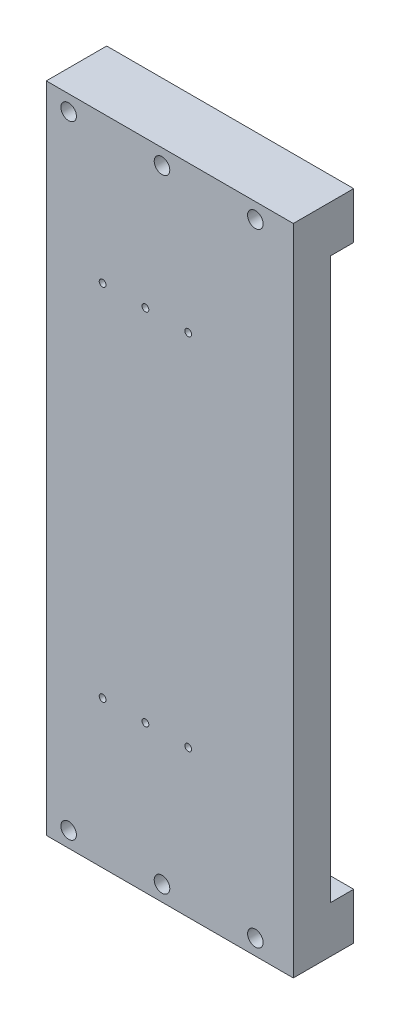
ISO-10303-21;
HEADER;
FILE_DESCRIPTION(('STEP AP214'),'2;1');
FILE_NAME('part.step','',(''),(''),'','','');
FILE_SCHEMA(('AUTOMOTIVE_DESIGN { 1 0 10303 214 1 1 1 1 }'));
ENDSEC;
DATA;
#1=APPLICATION_CONTEXT('core data for automotive mechanical design processes');
#2=APPLICATION_PROTOCOL_DEFINITION('international standard','automotive_design',2000,#1);
#3=PRODUCT_CONTEXT('',#1,'mechanical');
#4=PRODUCT('Part','Part','',(#3));
#5=PRODUCT_RELATED_PRODUCT_CATEGORY('part','',(#4));
#6=PRODUCT_DEFINITION_FORMATION('','',#4);
#7=PRODUCT_DEFINITION_CONTEXT('part definition',#1,'design');
#8=PRODUCT_DEFINITION('design','',#6,#7);
#9=PRODUCT_DEFINITION_SHAPE('','',#8);
#10=(LENGTH_UNIT() NAMED_UNIT(*) SI_UNIT(.MILLI.,.METRE.));
#11=(NAMED_UNIT(*) PLANE_ANGLE_UNIT() SI_UNIT($,.RADIAN.));
#12=(NAMED_UNIT(*) SI_UNIT($,.STERADIAN.) SOLID_ANGLE_UNIT());
#13=UNCERTAINTY_MEASURE_WITH_UNIT(LENGTH_MEASURE(1.E-05),#10,'distance_accuracy_value','');
#14=(GEOMETRIC_REPRESENTATION_CONTEXT(3) GLOBAL_UNCERTAINTY_ASSIGNED_CONTEXT((#13)) GLOBAL_UNIT_ASSIGNED_CONTEXT((#10,
#11,#12)) REPRESENTATION_CONTEXT('',''));
#15=CARTESIAN_POINT('',(0.,0.,0.));
#16=DIRECTION('',(0.,0.,1.));
#17=DIRECTION('',(1.,0.,0.));
#18=AXIS2_PLACEMENT_3D('',#15,#16,#17);
#19=CARTESIAN_POINT('',(0.,0.,9.525));
#20=DIRECTION('',(1.,0.,0.));
#21=DIRECTION('',(0.,0.,-1.));
#22=AXIS2_PLACEMENT_3D('',#19,#20,#21);
#23=PLANE('',#22);
#24=DIRECTION('',(0.,0.,-1.));
#25=VECTOR('',#24,1.);
#26=CARTESIAN_POINT('',(0.,168.,9.525));
#27=LINE('',#26,#25);
#28=CARTESIAN_POINT('',(0.,168.,9.525));
#29=VERTEX_POINT('',#28);
#30=CARTESIAN_POINT('',(0.,168.,-6.));
#31=VERTEX_POINT('',#30);
#32=EDGE_CURVE('E180',#29,#31,#27,.T.);
#33=ORIENTED_EDGE('',*,*,#32,.T.);
#34=DIRECTION('',(0.,1.,0.));
#35=VECTOR('',#34,1.);
#36=CARTESIAN_POINT('',(0.,168.,-6.));
#37=LINE('',#36,#35);
#38=CARTESIAN_POINT('',(0.,156.,-6.));
#39=VERTEX_POINT('',#38);
#40=EDGE_CURVE('E157',#39,#31,#37,.T.);
#41=ORIENTED_EDGE('',*,*,#40,.F.);
#42=DIRECTION('',(0.,0.,1.));
#43=VECTOR('',#42,1.);
#44=CARTESIAN_POINT('',(0.,156.,-6.));
#45=LINE('',#44,#43);
#46=CARTESIAN_POINT('',(0.,156.,0.));
#47=VERTEX_POINT('',#46);
#48=EDGE_CURVE('E163',#39,#47,#45,.T.);
#49=ORIENTED_EDGE('',*,*,#48,.T.);
#50=DIRECTION('',(0.,-1.,0.));
#51=VECTOR('',#50,1.);
#52=CARTESIAN_POINT('',(0.,0.,0.));
#53=LINE('',#52,#51);
#54=CARTESIAN_POINT('',(0.,12.0000000000001,0.));
#55=VERTEX_POINT('',#54);
#56=EDGE_CURVE('E171',#47,#55,#53,.T.);
#57=ORIENTED_EDGE('',*,*,#56,.T.);
#58=DIRECTION('',(0.,0.,1.));
#59=VECTOR('',#58,1.);
#60=CARTESIAN_POINT('',(0.,12.0000000000001,-6.));
#61=LINE('',#60,#59);
#62=CARTESIAN_POINT('',(0.,12.0000000000001,-6.));
#63=VERTEX_POINT('',#62);
#64=EDGE_CURVE('E130',#63,#55,#61,.T.);
#65=ORIENTED_EDGE('',*,*,#64,.F.);
#66=DIRECTION('',(0.,-1.,0.));
#67=VECTOR('',#66,1.);
#68=CARTESIAN_POINT('',(0.,1.11022302462516E-13,-6.));
#69=LINE('',#68,#67);
#70=CARTESIAN_POINT('',(0.,1.11022302462516E-13,-6.));
#71=VERTEX_POINT('',#70);
#72=EDGE_CURVE('E120',#63,#71,#69,.T.);
#73=ORIENTED_EDGE('',*,*,#72,.T.);
#74=DIRECTION('',(0.,0.,-1.));
#75=VECTOR('',#74,1.);
#76=CARTESIAN_POINT('',(0.,0.,9.525));
#77=LINE('',#76,#75);
#78=CARTESIAN_POINT('',(0.,0.,9.525));
#79=VERTEX_POINT('',#78);
#80=EDGE_CURVE('E11',#79,#71,#77,.T.);
#81=ORIENTED_EDGE('',*,*,#80,.F.);
#82=DIRECTION('',(0.,-1.,0.));
#83=VECTOR('',#82,1.);
#84=CARTESIAN_POINT('',(0.,0.,9.525));
#85=LINE('',#84,#83);
#86=EDGE_CURVE('E172',#29,#79,#85,.T.);
#87=ORIENTED_EDGE('',*,*,#86,.F.);
#88=EDGE_LOOP('',(#33,#41,#49,#57,#65,#73,#81,#87));
#89=FACE_BOUND('',#88,.T.);
#90=ADVANCED_FACE('F33',(#89),#23,.F.);
#91=CARTESIAN_POINT('',(0.,0.,9.525));
#92=DIRECTION('',(0.,1.,0.));
#93=DIRECTION('',(0.,0.,1.));
#94=AXIS2_PLACEMENT_3D('',#91,#92,#93);
#95=PLANE('',#94);
#96=ORIENTED_EDGE('',*,*,#80,.T.);
#97=DIRECTION('',(1.,0.,0.));
#98=VECTOR('',#97,1.);
#99=CARTESIAN_POINT('',(63.5,1.11022302462516E-13,-6.));
#100=LINE('',#99,#98);
#101=CARTESIAN_POINT('',(63.5,1.11022302462516E-13,-6.));
#102=VERTEX_POINT('',#101);
#103=EDGE_CURVE('E113',#71,#102,#100,.T.);
#104=ORIENTED_EDGE('',*,*,#103,.T.);
#105=DIRECTION('',(0.,0.,-1.));
#106=VECTOR('',#105,1.);
#107=CARTESIAN_POINT('',(63.5,0.,9.525));
#108=LINE('',#107,#106);
#109=CARTESIAN_POINT('',(63.5,0.,9.525));
#110=VERTEX_POINT('',#109);
#111=EDGE_CURVE('E41',#110,#102,#108,.T.);
#112=ORIENTED_EDGE('',*,*,#111,.F.);
#113=DIRECTION('',(1.,0.,0.));
#114=VECTOR('',#113,1.);
#115=CARTESIAN_POINT('',(0.,0.,9.525));
#116=LINE('',#115,#114);
#117=EDGE_CURVE('E175',#79,#110,#116,.T.);
#118=ORIENTED_EDGE('',*,*,#117,.F.);
#119=EDGE_LOOP('',(#96,#104,#112,#118));
#120=FACE_BOUND('',#119,.T.);
#121=ADVANCED_FACE('F118',(#120),#95,.F.);
#122=CARTESIAN_POINT('',(63.5,0.,9.525));
#123=DIRECTION('',(-1.,0.,0.));
#124=DIRECTION('',(0.,0.,1.));
#125=AXIS2_PLACEMENT_3D('',#122,#123,#124);
#126=PLANE('',#125);
#127=ORIENTED_EDGE('',*,*,#111,.T.);
#128=DIRECTION('',(0.,1.,0.));
#129=VECTOR('',#128,1.);
#130=CARTESIAN_POINT('',(63.5,1.11022302462516E-13,-6.));
#131=LINE('',#130,#129);
#132=CARTESIAN_POINT('',(63.5,12.0000000000001,-6.));
#133=VERTEX_POINT('',#132);
#134=EDGE_CURVE('E101',#102,#133,#131,.T.);
#135=ORIENTED_EDGE('',*,*,#134,.T.);
#136=DIRECTION('',(0.,0.,1.));
#137=VECTOR('',#136,1.);
#138=CARTESIAN_POINT('',(63.5,12.0000000000001,-6.));
#139=LINE('',#138,#137);
#140=CARTESIAN_POINT('',(63.5,12.0000000000001,0.));
#141=VERTEX_POINT('',#140);
#142=EDGE_CURVE('E126',#133,#141,#139,.T.);
#143=ORIENTED_EDGE('',*,*,#142,.T.);
#144=DIRECTION('',(0.,1.,0.));
#145=VECTOR('',#144,1.);
#146=CARTESIAN_POINT('',(63.5,0.,0.));
#147=LINE('',#146,#145);
#148=CARTESIAN_POINT('',(63.5,156.,0.));
#149=VERTEX_POINT('',#148);
#150=EDGE_CURVE('E56',#141,#149,#147,.T.);
#151=ORIENTED_EDGE('',*,*,#150,.T.);
#152=DIRECTION('',(0.,0.,1.));
#153=VECTOR('',#152,1.);
#154=CARTESIAN_POINT('',(63.5,156.,-6.));
#155=LINE('',#154,#153);
#156=CARTESIAN_POINT('',(63.5,156.,-6.));
#157=VERTEX_POINT('',#156);
#158=EDGE_CURVE('E168',#157,#149,#155,.T.);
#159=ORIENTED_EDGE('',*,*,#158,.F.);
#160=DIRECTION('',(0.,-1.,0.));
#161=VECTOR('',#160,1.);
#162=CARTESIAN_POINT('',(63.5,168.,-6.));
#163=LINE('',#162,#161);
#164=CARTESIAN_POINT('',(63.5,168.,-6.));
#165=VERTEX_POINT('',#164);
#166=EDGE_CURVE('E152',#165,#157,#163,.T.);
#167=ORIENTED_EDGE('',*,*,#166,.F.);
#168=DIRECTION('',(0.,0.,-1.));
#169=VECTOR('',#168,1.);
#170=CARTESIAN_POINT('',(63.5,168.,9.525));
#171=LINE('',#170,#169);
#172=CARTESIAN_POINT('',(63.5,168.,9.525));
#173=VERTEX_POINT('',#172);
#174=EDGE_CURVE('E107',#173,#165,#171,.T.);
#175=ORIENTED_EDGE('',*,*,#174,.F.);
#176=DIRECTION('',(0.,1.,0.));
#177=VECTOR('',#176,1.);
#178=CARTESIAN_POINT('',(63.5,0.,9.525));
#179=LINE('',#178,#177);
#180=EDGE_CURVE('E104',#110,#173,#179,.T.);
#181=ORIENTED_EDGE('',*,*,#180,.F.);
#182=EDGE_LOOP('',(#127,#135,#143,#151,#159,#167,#175,#181));
#183=FACE_BOUND('',#182,.T.);
#184=ADVANCED_FACE('F100',(#183),#126,.F.);
#185=CARTESIAN_POINT('',(0.,168.,9.525));
#186=DIRECTION('',(0.,-1.,0.));
#187=DIRECTION('',(0.,0.,-1.));
#188=AXIS2_PLACEMENT_3D('',#185,#186,#187);
#189=PLANE('',#188);
#190=ORIENTED_EDGE('',*,*,#174,.T.);
#191=DIRECTION('',(1.,0.,0.));
#192=VECTOR('',#191,1.);
#193=CARTESIAN_POINT('',(63.5,168.,-6.));
#194=LINE('',#193,#192);
#195=EDGE_CURVE('E160',#31,#165,#194,.T.);
#196=ORIENTED_EDGE('',*,*,#195,.F.);
#197=ORIENTED_EDGE('',*,*,#32,.F.);
#198=DIRECTION('',(-1.,0.,0.));
#199=VECTOR('',#198,1.);
#200=CARTESIAN_POINT('',(0.,168.,9.525));
#201=LINE('',#200,#199);
#202=EDGE_CURVE('E178',#173,#29,#201,.T.);
#203=ORIENTED_EDGE('',*,*,#202,.F.);
#204=EDGE_LOOP('',(#190,#196,#197,#203));
#205=FACE_BOUND('',#204,.T.);
#206=ADVANCED_FACE('F264',(#205),#189,.F.);
#207=CARTESIAN_POINT('',(0.,0.,9.525));
#208=DIRECTION('',(0.,0.,-1.));
#209=DIRECTION('',(-1.,0.,0.));
#210=AXIS2_PLACEMENT_3D('',#207,#208,#209);
#211=PLANE('',#210);
#212=CARTESIAN_POINT('',(14.4796708439643,37.8143086469681,9.525));
#213=DIRECTION('',(0.,0.,1.));
#214=DIRECTION('',(-1.,0.,0.));
#215=AXIS2_PLACEMENT_3D('',#212,#213,#214);
#216=CIRCLE('',#215,0.877320143374055);
#217=CARTESIAN_POINT('',(13.6023507005903,37.8143086469681,9.525));
#218=VERTEX_POINT('',#217);
#219=EDGE_CURVE('E199',#218,#218,#216,.T.);
#220=ORIENTED_EDGE('',*,*,#219,.F.);
#221=EDGE_LOOP('',(#220));
#222=FACE_BOUND('',#221,.T.);
#223=CARTESIAN_POINT('',(25.4796708439643,37.8143086469681,9.525));
#224=DIRECTION('',(0.,0.,1.));
#225=DIRECTION('',(-1.,0.,0.));
#226=AXIS2_PLACEMENT_3D('',#223,#224,#225);
#227=CIRCLE('',#226,0.877320143374055);
#228=CARTESIAN_POINT('',(24.6023507005903,37.8143086469681,9.525));
#229=VERTEX_POINT('',#228);
#230=EDGE_CURVE('E441',#229,#229,#227,.T.);
#231=ORIENTED_EDGE('',*,*,#230,.F.);
#232=EDGE_LOOP('',(#231));
#233=FACE_BOUND('',#232,.T.);
#234=CARTESIAN_POINT('',(36.4796708439643,37.8143086469681,9.525));
#235=DIRECTION('',(0.,0.,1.));
#236=DIRECTION('',(-1.,0.,0.));
#237=AXIS2_PLACEMENT_3D('',#234,#235,#236);
#238=CIRCLE('',#237,0.877320143374051);
#239=CARTESIAN_POINT('',(35.6023507005903,37.8143086469681,9.525));
#240=VERTEX_POINT('',#239);
#241=EDGE_CURVE('E444',#240,#240,#238,.T.);
#242=ORIENTED_EDGE('',*,*,#241,.F.);
#243=EDGE_LOOP('',(#242));
#244=FACE_BOUND('',#243,.T.);
#245=CARTESIAN_POINT('',(14.4796708439643,130.185691353032,9.525));
#246=DIRECTION('',(0.,0.,-1.));
#247=DIRECTION('',(-1.,0.,0.));
#248=AXIS2_PLACEMENT_3D('',#245,#246,#247);
#249=CIRCLE('',#248,0.877320143374055);
#250=CARTESIAN_POINT('',(13.6023507005903,130.185691353032,9.525));
#251=VERTEX_POINT('',#250);
#252=EDGE_CURVE('E189',#251,#251,#249,.T.);
#253=ORIENTED_EDGE('',*,*,#252,.T.);
#254=EDGE_LOOP('',(#253));
#255=FACE_BOUND('',#254,.T.);
#256=CARTESIAN_POINT('',(25.4796708439643,130.185691353032,9.525));
#257=DIRECTION('',(0.,0.,-1.));
#258=DIRECTION('',(-1.,0.,0.));
#259=AXIS2_PLACEMENT_3D('',#256,#257,#258);
#260=CIRCLE('',#259,0.877320143374055);
#261=CARTESIAN_POINT('',(24.6023507005903,130.185691353032,9.525));
#262=VERTEX_POINT('',#261);
#263=EDGE_CURVE('E208',#262,#262,#260,.T.);
#264=ORIENTED_EDGE('',*,*,#263,.T.);
#265=EDGE_LOOP('',(#264));
#266=FACE_BOUND('',#265,.T.);
#267=CARTESIAN_POINT('',(36.4796708439643,130.185691353032,9.525));
#268=DIRECTION('',(0.,0.,-1.));
#269=DIRECTION('',(-1.,0.,0.));
#270=AXIS2_PLACEMENT_3D('',#267,#268,#269);
#271=CIRCLE('',#270,0.877320143374051);
#272=CARTESIAN_POINT('',(35.6023507005903,130.185691353032,9.525));
#273=VERTEX_POINT('',#272);
#274=EDGE_CURVE('E204',#273,#273,#271,.T.);
#275=ORIENTED_EDGE('',*,*,#274,.T.);
#276=EDGE_LOOP('',(#275));
#277=FACE_BOUND('',#276,.T.);
#278=CARTESIAN_POINT('',(5.74011002010241,4.00000000000009,9.525));
#279=DIRECTION('',(0.,0.,1.));
#280=DIRECTION('',(-1.,0.,0.));
#281=AXIS2_PLACEMENT_3D('',#278,#279,#280);
#282=CIRCLE('',#281,2.00000000000001);
#283=CARTESIAN_POINT('',(3.7401100201024,4.00000000000009,9.525));
#284=VERTEX_POINT('',#283);
#285=EDGE_CURVE('E128',#284,#284,#282,.T.);
#286=ORIENTED_EDGE('',*,*,#285,.F.);
#287=EDGE_LOOP('',(#286));
#288=FACE_BOUND('',#287,.T.);
#289=CARTESIAN_POINT('',(53.7401100201024,4.00000000000009,9.525));
#290=DIRECTION('',(0.,0.,1.));
#291=DIRECTION('',(-1.,0.,0.));
#292=AXIS2_PLACEMENT_3D('',#289,#290,#291);
#293=CIRCLE('',#292,2.00000000000002);
#294=CARTESIAN_POINT('',(51.7401100201024,4.00000000000009,9.525));
#295=VERTEX_POINT('',#294);
#296=EDGE_CURVE('E221',#295,#295,#293,.T.);
#297=ORIENTED_EDGE('',*,*,#296,.F.);
#298=EDGE_LOOP('',(#297));
#299=FACE_BOUND('',#298,.T.);
#300=CARTESIAN_POINT('',(29.7401100201024,4.00000000000009,9.525));
#301=DIRECTION('',(0.,0.,1.));
#302=DIRECTION('',(-1.,0.,0.));
#303=AXIS2_PLACEMENT_3D('',#300,#301,#302);
#304=CIRCLE('',#303,2.);
#305=CARTESIAN_POINT('',(27.7401100201024,4.00000000000009,9.525));
#306=VERTEX_POINT('',#305);
#307=EDGE_CURVE('E227',#306,#306,#304,.T.);
#308=ORIENTED_EDGE('',*,*,#307,.F.);
#309=EDGE_LOOP('',(#308));
#310=FACE_BOUND('',#309,.T.);
#311=CARTESIAN_POINT('',(5.74011002010241,164.,9.525));
#312=DIRECTION('',(0.,0.,-1.));
#313=DIRECTION('',(-1.,0.,0.));
#314=AXIS2_PLACEMENT_3D('',#311,#312,#313);
#315=CIRCLE('',#314,2.00000000000001);
#316=CARTESIAN_POINT('',(3.7401100201024,164.,9.525));
#317=VERTEX_POINT('',#316);
#318=EDGE_CURVE('E134',#317,#317,#315,.T.);
#319=ORIENTED_EDGE('',*,*,#318,.T.);
#320=EDGE_LOOP('',(#319));
#321=FACE_BOUND('',#320,.T.);
#322=CARTESIAN_POINT('',(53.7401100201024,164.,9.525));
#323=DIRECTION('',(0.,0.,-1.));
#324=DIRECTION('',(-1.,0.,0.));
#325=AXIS2_PLACEMENT_3D('',#322,#323,#324);
#326=CIRCLE('',#325,2.00000000000002);
#327=CARTESIAN_POINT('',(51.7401100201024,164.,9.525));
#328=VERTEX_POINT('',#327);
#329=EDGE_CURVE('E141',#328,#328,#326,.T.);
#330=ORIENTED_EDGE('',*,*,#329,.T.);
#331=EDGE_LOOP('',(#330));
#332=FACE_BOUND('',#331,.T.);
#333=CARTESIAN_POINT('',(29.7401100201024,164.,9.525));
#334=DIRECTION('',(0.,0.,-1.));
#335=DIRECTION('',(-1.,0.,0.));
#336=AXIS2_PLACEMENT_3D('',#333,#334,#335);
#337=CIRCLE('',#336,2.);
#338=CARTESIAN_POINT('',(27.7401100201024,164.,9.525));
#339=VERTEX_POINT('',#338);
#340=EDGE_CURVE('E147',#339,#339,#337,.T.);
#341=ORIENTED_EDGE('',*,*,#340,.T.);
#342=EDGE_LOOP('',(#341));
#343=FACE_BOUND('',#342,.T.);
#344=ORIENTED_EDGE('',*,*,#86,.T.);
#345=ORIENTED_EDGE('',*,*,#117,.T.);
#346=ORIENTED_EDGE('',*,*,#180,.T.);
#347=ORIENTED_EDGE('',*,*,#202,.T.);
#348=EDGE_LOOP('',(#344,#345,#346,#347));
#349=FACE_BOUND('',#348,.T.);
#350=ADVANCED_FACE('F291',(#222,#233,#244,#255,#266,#277,#288,#299,#310,#321,#332,#343,#349),
#211,.F.);
#351=CARTESIAN_POINT('',(0.,0.,0.));
#352=DIRECTION('',(0.,0.,-1.));
#353=DIRECTION('',(-1.,0.,0.));
#354=AXIS2_PLACEMENT_3D('',#351,#352,#353);
#355=PLANE('',#354);
#356=CARTESIAN_POINT('',(14.4796708439643,37.8143086469681,0.));
#357=DIRECTION('',(0.,0.,-1.));
#358=DIRECTION('',(-1.,0.,0.));
#359=AXIS2_PLACEMENT_3D('',#356,#357,#358);
#360=CIRCLE('',#359,0.877320143374055);
#361=CARTESIAN_POINT('',(13.6023507005903,37.8143086469681,0.));
#362=VERTEX_POINT('',#361);
#363=EDGE_CURVE('E36',#362,#362,#360,.T.);
#364=ORIENTED_EDGE('',*,*,#363,.F.);
#365=EDGE_LOOP('',(#364));
#366=FACE_BOUND('',#365,.T.);
#367=CARTESIAN_POINT('',(25.4796708439643,37.8143086469681,0.));
#368=DIRECTION('',(0.,0.,-1.));
#369=DIRECTION('',(-1.,0.,0.));
#370=AXIS2_PLACEMENT_3D('',#367,#368,#369);
#371=CIRCLE('',#370,0.877320143374055);
#372=CARTESIAN_POINT('',(24.6023507005903,37.8143086469681,0.));
#373=VERTEX_POINT('',#372);
#374=EDGE_CURVE('E198',#373,#373,#371,.T.);
#375=ORIENTED_EDGE('',*,*,#374,.F.);
#376=EDGE_LOOP('',(#375));
#377=FACE_BOUND('',#376,.T.);
#378=CARTESIAN_POINT('',(36.4796708439643,37.8143086469681,0.));
#379=DIRECTION('',(0.,0.,-1.));
#380=DIRECTION('',(-1.,0.,0.));
#381=AXIS2_PLACEMENT_3D('',#378,#379,#380);
#382=CIRCLE('',#381,0.877320143374051);
#383=CARTESIAN_POINT('',(35.6023507005903,37.8143086469681,0.));
#384=VERTEX_POINT('',#383);
#385=EDGE_CURVE('E196',#384,#384,#382,.T.);
#386=ORIENTED_EDGE('',*,*,#385,.F.);
#387=EDGE_LOOP('',(#386));
#388=FACE_BOUND('',#387,.T.);
#389=CARTESIAN_POINT('',(14.4796708439643,130.185691353032,0.));
#390=DIRECTION('',(0.,0.,-1.));
#391=DIRECTION('',(-1.,0.,0.));
#392=AXIS2_PLACEMENT_3D('',#389,#390,#391);
#393=CIRCLE('',#392,0.877320143374055);
#394=CARTESIAN_POINT('',(13.6023507005903,130.185691353032,0.));
#395=VERTEX_POINT('',#394);
#396=EDGE_CURVE('E192',#395,#395,#393,.F.);
#397=ORIENTED_EDGE('',*,*,#396,.T.);
#398=EDGE_LOOP('',(#397));
#399=FACE_BOUND('',#398,.T.);
#400=CARTESIAN_POINT('',(25.4796708439643,130.185691353032,0.));
#401=DIRECTION('',(0.,0.,-1.));
#402=DIRECTION('',(-1.,0.,0.));
#403=AXIS2_PLACEMENT_3D('',#400,#401,#402);
#404=CIRCLE('',#403,0.877320143374055);
#405=CARTESIAN_POINT('',(24.6023507005903,130.185691353032,0.));
#406=VERTEX_POINT('',#405);
#407=EDGE_CURVE('E188',#406,#406,#404,.F.);
#408=ORIENTED_EDGE('',*,*,#407,.T.);
#409=EDGE_LOOP('',(#408));
#410=FACE_BOUND('',#409,.T.);
#411=CARTESIAN_POINT('',(36.4796708439643,130.185691353032,0.));
#412=DIRECTION('',(0.,0.,-1.));
#413=DIRECTION('',(-1.,0.,0.));
#414=AXIS2_PLACEMENT_3D('',#411,#412,#413);
#415=CIRCLE('',#414,0.877320143374051);
#416=CARTESIAN_POINT('',(35.6023507005903,130.185691353032,0.));
#417=VERTEX_POINT('',#416);
#418=EDGE_CURVE('E185',#417,#417,#415,.F.);
#419=ORIENTED_EDGE('',*,*,#418,.T.);
#420=EDGE_LOOP('',(#419));
#421=FACE_BOUND('',#420,.T.);
#422=DIRECTION('',(-1.,0.,0.));
#423=VECTOR('',#422,1.);
#424=CARTESIAN_POINT('',(63.5,12.0000000000001,0.));
#425=LINE('',#424,#423);
#426=EDGE_CURVE('E49',#141,#55,#425,.T.);
#427=ORIENTED_EDGE('',*,*,#426,.T.);
#428=ORIENTED_EDGE('',*,*,#56,.F.);
#429=DIRECTION('',(-1.,0.,0.));
#430=VECTOR('',#429,1.);
#431=CARTESIAN_POINT('',(63.5,156.,0.));
#432=LINE('',#431,#430);
#433=EDGE_CURVE('E137',#149,#47,#432,.T.);
#434=ORIENTED_EDGE('',*,*,#433,.F.);
#435=ORIENTED_EDGE('',*,*,#150,.F.);
#436=EDGE_LOOP('',(#427,#428,#434,#435));
#437=FACE_BOUND('',#436,.T.);
#438=ADVANCED_FACE('F290',(#366,#377,#388,#399,#410,#421,#437),#355,.T.);
#439=CARTESIAN_POINT('',(63.5,156.,-6.));
#440=DIRECTION('',(0.,1.,0.));
#441=DIRECTION('',(0.,0.,1.));
#442=AXIS2_PLACEMENT_3D('',#439,#440,#441);
#443=PLANE('',#442);
#444=ORIENTED_EDGE('',*,*,#433,.T.);
#445=ORIENTED_EDGE('',*,*,#48,.F.);
#446=DIRECTION('',(-1.,0.,0.));
#447=VECTOR('',#446,1.);
#448=CARTESIAN_POINT('',(63.5,156.,-6.));
#449=LINE('',#448,#447);
#450=EDGE_CURVE('E155',#157,#39,#449,.T.);
#451=ORIENTED_EDGE('',*,*,#450,.F.);
#452=ORIENTED_EDGE('',*,*,#158,.T.);
#453=EDGE_LOOP('',(#444,#445,#451,#452));
#454=FACE_BOUND('',#453,.T.);
#455=ADVANCED_FACE('F266',(#454),#443,.F.);
#456=CARTESIAN_POINT('',(0.,0.,-6.));
#457=DIRECTION('',(0.,0.,-1.));
#458=DIRECTION('',(-1.,0.,0.));
#459=AXIS2_PLACEMENT_3D('',#456,#457,#458);
#460=PLANE('',#459);
#461=CARTESIAN_POINT('',(5.74011002010241,164.,-6.));
#462=DIRECTION('',(0.,0.,-1.));
#463=DIRECTION('',(-1.,0.,0.));
#464=AXIS2_PLACEMENT_3D('',#461,#462,#463);
#465=CIRCLE('',#464,2.00000000000001);
#466=CARTESIAN_POINT('',(3.7401100201024,164.,-6.));
#467=VERTEX_POINT('',#466);
#468=EDGE_CURVE('E138',#467,#467,#465,.T.);
#469=ORIENTED_EDGE('',*,*,#468,.F.);
#470=EDGE_LOOP('',(#469));
#471=FACE_BOUND('',#470,.T.);
#472=CARTESIAN_POINT('',(53.7401100201024,164.,-6.));
#473=DIRECTION('',(0.,0.,-1.));
#474=DIRECTION('',(-1.,0.,0.));
#475=AXIS2_PLACEMENT_3D('',#472,#473,#474);
#476=CIRCLE('',#475,2.00000000000002);
#477=CARTESIAN_POINT('',(51.7401100201024,164.,-6.));
#478=VERTEX_POINT('',#477);
#479=EDGE_CURVE('E144',#478,#478,#476,.T.);
#480=ORIENTED_EDGE('',*,*,#479,.F.);
#481=EDGE_LOOP('',(#480));
#482=FACE_BOUND('',#481,.T.);
#483=CARTESIAN_POINT('',(29.7401100201024,164.,-6.));
#484=DIRECTION('',(0.,0.,-1.));
#485=DIRECTION('',(-1.,0.,0.));
#486=AXIS2_PLACEMENT_3D('',#483,#484,#485);
#487=CIRCLE('',#486,2.);
#488=CARTESIAN_POINT('',(27.7401100201024,164.,-6.));
#489=VERTEX_POINT('',#488);
#490=EDGE_CURVE('E133',#489,#489,#487,.T.);
#491=ORIENTED_EDGE('',*,*,#490,.F.);
#492=EDGE_LOOP('',(#491));
#493=FACE_BOUND('',#492,.T.);
#494=ORIENTED_EDGE('',*,*,#166,.T.);
#495=ORIENTED_EDGE('',*,*,#450,.T.);
#496=ORIENTED_EDGE('',*,*,#40,.T.);
#497=ORIENTED_EDGE('',*,*,#195,.T.);
#498=EDGE_LOOP('',(#494,#495,#496,#497));
#499=FACE_BOUND('',#498,.T.);
#500=ADVANCED_FACE('F261',(#471,#482,#493,#499),#460,.T.);
#501=CARTESIAN_POINT('',(29.7401100201024,164.,9.525));
#502=DIRECTION('',(0.,0.,-1.));
#503=DIRECTION('',(-1.,0.,0.));
#504=AXIS2_PLACEMENT_3D('',#501,#502,#503);
#505=CYLINDRICAL_SURFACE('',#504,2.);
#506=ORIENTED_EDGE('',*,*,#340,.F.);
#507=EDGE_LOOP('',(#506));
#508=FACE_BOUND('',#507,.T.);
#509=ORIENTED_EDGE('',*,*,#490,.T.);
#510=EDGE_LOOP('',(#509));
#511=FACE_BOUND('',#510,.T.);
#512=ADVANCED_FACE('F280',(#508,#511),#505,.F.);
#513=CARTESIAN_POINT('',(53.7401100201024,164.,9.525));
#514=DIRECTION('',(0.,0.,-1.));
#515=DIRECTION('',(-1.,0.,0.));
#516=AXIS2_PLACEMENT_3D('',#513,#514,#515);
#517=CYLINDRICAL_SURFACE('',#516,2.00000000000002);
#518=ORIENTED_EDGE('',*,*,#329,.F.);
#519=EDGE_LOOP('',(#518));
#520=FACE_BOUND('',#519,.T.);
#521=ORIENTED_EDGE('',*,*,#479,.T.);
#522=EDGE_LOOP('',(#521));
#523=FACE_BOUND('',#522,.T.);
#524=ADVANCED_FACE('F274',(#520,#523),#517,.F.);
#525=CARTESIAN_POINT('',(5.74011002010241,164.,9.525));
#526=DIRECTION('',(0.,0.,-1.));
#527=DIRECTION('',(-1.,0.,0.));
#528=AXIS2_PLACEMENT_3D('',#525,#526,#527);
#529=CYLINDRICAL_SURFACE('',#528,2.00000000000001);
#530=ORIENTED_EDGE('',*,*,#318,.F.);
#531=EDGE_LOOP('',(#530));
#532=FACE_BOUND('',#531,.T.);
#533=ORIENTED_EDGE('',*,*,#468,.T.);
#534=EDGE_LOOP('',(#533));
#535=FACE_BOUND('',#534,.T.);
#536=ADVANCED_FACE('F269',(#532,#535),#529,.F.);
#537=CARTESIAN_POINT('',(63.5,12.0000000000001,-6.));
#538=DIRECTION('',(0.,1.,0.));
#539=DIRECTION('',(0.,0.,1.));
#540=AXIS2_PLACEMENT_3D('',#537,#538,#539);
#541=PLANE('',#540);
#542=ORIENTED_EDGE('',*,*,#426,.F.);
#543=ORIENTED_EDGE('',*,*,#142,.F.);
#544=DIRECTION('',(-1.,0.,0.));
#545=VECTOR('',#544,1.);
#546=CARTESIAN_POINT('',(63.5,12.0000000000001,-6.));
#547=LINE('',#546,#545);
#548=EDGE_CURVE('E116',#133,#63,#547,.T.);
#549=ORIENTED_EDGE('',*,*,#548,.T.);
#550=ORIENTED_EDGE('',*,*,#64,.T.);
#551=EDGE_LOOP('',(#542,#543,#549,#550));
#552=FACE_BOUND('',#551,.T.);
#553=ADVANCED_FACE('F245',(#552),#541,.T.);
#554=CARTESIAN_POINT('',(0.,168.,-6.));
#555=DIRECTION('',(0.,0.,-1.));
#556=DIRECTION('',(-1.,0.,0.));
#557=AXIS2_PLACEMENT_3D('',#554,#555,#556);
#558=PLANE('',#557);
#559=CARTESIAN_POINT('',(5.74011002010241,4.00000000000009,-6.));
#560=DIRECTION('',(0.,0.,1.));
#561=DIRECTION('',(-1.,0.,0.));
#562=AXIS2_PLACEMENT_3D('',#559,#560,#561);
#563=CIRCLE('',#562,2.00000000000001);
#564=CARTESIAN_POINT('',(3.7401100201024,4.00000000000009,-6.));
#565=VERTEX_POINT('',#564);
#566=EDGE_CURVE('E218',#565,#565,#563,.T.);
#567=ORIENTED_EDGE('',*,*,#566,.T.);
#568=EDGE_LOOP('',(#567));
#569=FACE_BOUND('',#568,.T.);
#570=CARTESIAN_POINT('',(53.7401100201024,4.00000000000009,-6.));
#571=DIRECTION('',(0.,0.,1.));
#572=DIRECTION('',(-1.,0.,0.));
#573=AXIS2_PLACEMENT_3D('',#570,#571,#572);
#574=CIRCLE('',#573,2.00000000000002);
#575=CARTESIAN_POINT('',(51.7401100201024,4.00000000000009,-6.));
#576=VERTEX_POINT('',#575);
#577=EDGE_CURVE('E224',#576,#576,#574,.T.);
#578=ORIENTED_EDGE('',*,*,#577,.T.);
#579=EDGE_LOOP('',(#578));
#580=FACE_BOUND('',#579,.T.);
#581=CARTESIAN_POINT('',(29.7401100201024,4.00000000000009,-6.));
#582=DIRECTION('',(0.,0.,1.));
#583=DIRECTION('',(-1.,0.,0.));
#584=AXIS2_PLACEMENT_3D('',#581,#582,#583);
#585=CIRCLE('',#584,2.);
#586=CARTESIAN_POINT('',(27.7401100201024,4.00000000000009,-6.));
#587=VERTEX_POINT('',#586);
#588=EDGE_CURVE('E195',#587,#587,#585,.T.);
#589=ORIENTED_EDGE('',*,*,#588,.T.);
#590=EDGE_LOOP('',(#589));
#591=FACE_BOUND('',#590,.T.);
#592=ORIENTED_EDGE('',*,*,#134,.F.);
#593=ORIENTED_EDGE('',*,*,#103,.F.);
#594=ORIENTED_EDGE('',*,*,#72,.F.);
#595=ORIENTED_EDGE('',*,*,#548,.F.);
#596=EDGE_LOOP('',(#592,#593,#594,#595));
#597=FACE_BOUND('',#596,.T.);
#598=ADVANCED_FACE('F111',(#569,#580,#591,#597),#558,.T.);
#599=CARTESIAN_POINT('',(29.7401100201024,4.00000000000009,9.525));
#600=DIRECTION('',(0.,0.,-1.));
#601=DIRECTION('',(-1.,0.,0.));
#602=AXIS2_PLACEMENT_3D('',#599,#600,#601);
#603=CYLINDRICAL_SURFACE('',#602,2.);
#604=ORIENTED_EDGE('',*,*,#307,.T.);
#605=EDGE_LOOP('',(#604));
#606=FACE_BOUND('',#605,.T.);
#607=ORIENTED_EDGE('',*,*,#588,.F.);
#608=EDGE_LOOP('',(#607));
#609=FACE_BOUND('',#608,.T.);
#610=ADVANCED_FACE('F233',(#606,#609),#603,.F.);
#611=CARTESIAN_POINT('',(53.7401100201024,4.00000000000009,9.525));
#612=DIRECTION('',(0.,0.,-1.));
#613=DIRECTION('',(-1.,0.,0.));
#614=AXIS2_PLACEMENT_3D('',#611,#612,#613);
#615=CYLINDRICAL_SURFACE('',#614,2.00000000000002);
#616=ORIENTED_EDGE('',*,*,#296,.T.);
#617=EDGE_LOOP('',(#616));
#618=FACE_BOUND('',#617,.T.);
#619=ORIENTED_EDGE('',*,*,#577,.F.);
#620=EDGE_LOOP('',(#619));
#621=FACE_BOUND('',#620,.T.);
#622=ADVANCED_FACE('F235',(#618,#621),#615,.F.);
#623=CARTESIAN_POINT('',(5.74011002010241,4.00000000000009,9.525));
#624=DIRECTION('',(0.,0.,-1.));
#625=DIRECTION('',(-1.,0.,0.));
#626=AXIS2_PLACEMENT_3D('',#623,#624,#625);
#627=CYLINDRICAL_SURFACE('',#626,2.00000000000001);
#628=ORIENTED_EDGE('',*,*,#285,.T.);
#629=EDGE_LOOP('',(#628));
#630=FACE_BOUND('',#629,.T.);
#631=ORIENTED_EDGE('',*,*,#566,.F.);
#632=EDGE_LOOP('',(#631));
#633=FACE_BOUND('',#632,.T.);
#634=ADVANCED_FACE('F242',(#630,#633),#627,.F.);
#635=CARTESIAN_POINT('',(36.4796708439643,130.185691353032,-6.));
#636=DIRECTION('',(0.,0.,1.));
#637=DIRECTION('',(1.,0.,0.));
#638=AXIS2_PLACEMENT_3D('',#635,#636,#637);
#639=CYLINDRICAL_SURFACE('',#638,0.877320143374051);
#640=ORIENTED_EDGE('',*,*,#418,.F.);
#641=EDGE_LOOP('',(#640));
#642=FACE_BOUND('',#641,.T.);
#643=ORIENTED_EDGE('',*,*,#274,.F.);
#644=EDGE_LOOP('',(#643));
#645=FACE_BOUND('',#644,.T.);
#646=ADVANCED_FACE('F376',(#642,#645),#639,.F.);
#647=CARTESIAN_POINT('',(25.4796708439643,130.185691353032,-6.));
#648=DIRECTION('',(0.,0.,1.));
#649=DIRECTION('',(1.,0.,0.));
#650=AXIS2_PLACEMENT_3D('',#647,#648,#649);
#651=CYLINDRICAL_SURFACE('',#650,0.877320143374055);
#652=ORIENTED_EDGE('',*,*,#407,.F.);
#653=EDGE_LOOP('',(#652));
#654=FACE_BOUND('',#653,.T.);
#655=ORIENTED_EDGE('',*,*,#263,.F.);
#656=EDGE_LOOP('',(#655));
#657=FACE_BOUND('',#656,.T.);
#658=ADVANCED_FACE('F385',(#654,#657),#651,.F.);
#659=CARTESIAN_POINT('',(14.4796708439643,130.185691353032,-6.));
#660=DIRECTION('',(0.,0.,1.));
#661=DIRECTION('',(1.,0.,0.));
#662=AXIS2_PLACEMENT_3D('',#659,#660,#661);
#663=CYLINDRICAL_SURFACE('',#662,0.877320143374055);
#664=ORIENTED_EDGE('',*,*,#396,.F.);
#665=EDGE_LOOP('',(#664));
#666=FACE_BOUND('',#665,.T.);
#667=ORIENTED_EDGE('',*,*,#252,.F.);
#668=EDGE_LOOP('',(#667));
#669=FACE_BOUND('',#668,.T.);
#670=ADVANCED_FACE('F394',(#666,#669),#663,.F.);
#671=CARTESIAN_POINT('',(36.4796708439643,37.8143086469681,-6.));
#672=DIRECTION('',(0.,0.,1.));
#673=DIRECTION('',(1.,0.,0.));
#674=AXIS2_PLACEMENT_3D('',#671,#672,#673);
#675=CYLINDRICAL_SURFACE('',#674,0.877320143374051);
#676=ORIENTED_EDGE('',*,*,#385,.T.);
#677=EDGE_LOOP('',(#676));
#678=FACE_BOUND('',#677,.T.);
#679=ORIENTED_EDGE('',*,*,#241,.T.);
#680=EDGE_LOOP('',(#679));
#681=FACE_BOUND('',#680,.T.);
#682=ADVANCED_FACE('F403',(#678,#681),#675,.F.);
#683=CARTESIAN_POINT('',(25.4796708439643,37.8143086469681,-6.));
#684=DIRECTION('',(0.,0.,1.));
#685=DIRECTION('',(1.,0.,0.));
#686=AXIS2_PLACEMENT_3D('',#683,#684,#685);
#687=CYLINDRICAL_SURFACE('',#686,0.877320143374055);
#688=ORIENTED_EDGE('',*,*,#374,.T.);
#689=EDGE_LOOP('',(#688));
#690=FACE_BOUND('',#689,.T.);
#691=ORIENTED_EDGE('',*,*,#230,.T.);
#692=EDGE_LOOP('',(#691));
#693=FACE_BOUND('',#692,.T.);
#694=ADVANCED_FACE('F412',(#690,#693),#687,.F.);
#695=CARTESIAN_POINT('',(14.4796708439643,37.8143086469681,-6.));
#696=DIRECTION('',(0.,0.,1.));
#697=DIRECTION('',(1.,0.,0.));
#698=AXIS2_PLACEMENT_3D('',#695,#696,#697);
#699=CYLINDRICAL_SURFACE('',#698,0.877320143374055);
#700=ORIENTED_EDGE('',*,*,#363,.T.);
#701=EDGE_LOOP('',(#700));
#702=FACE_BOUND('',#701,.T.);
#703=ORIENTED_EDGE('',*,*,#219,.T.);
#704=EDGE_LOOP('',(#703));
#705=FACE_BOUND('',#704,.T.);
#706=ADVANCED_FACE('F421',(#702,#705),#699,.F.);
#707=CLOSED_SHELL('',(#90,#121,#184,#206,#350,#438,#455,#500,#512,#524,#536,#553,#598,#610,#622,
#634,#646,#658,#670,#682,#694,#706));
#708=MANIFOLD_SOLID_BREP('B2',#707);
#709=ADVANCED_BREP_SHAPE_REPRESENTATION('',(#18,#708),#14);
#710=SHAPE_DEFINITION_REPRESENTATION(#9,#709);
ENDSEC;
END-ISO-10303-21;
